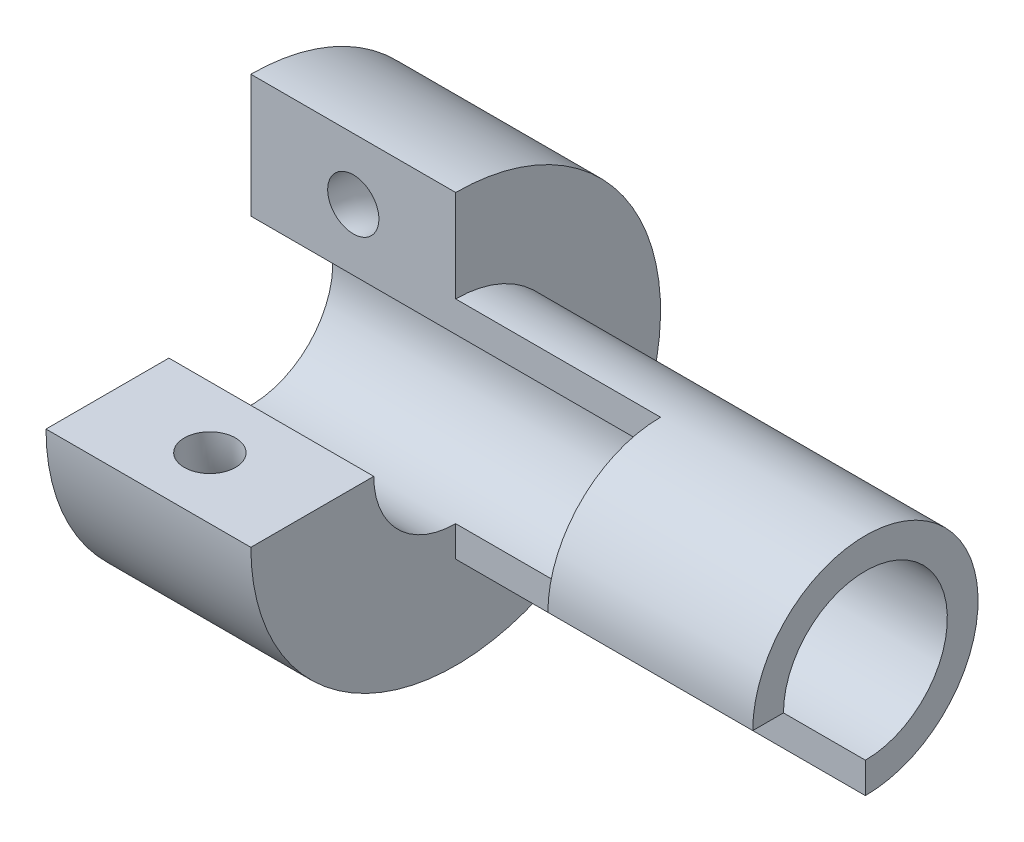
ISO-10303-21;
HEADER;
FILE_DESCRIPTION(('STEP AP214'),'2;1');
FILE_NAME('part.step','',(''),(''),'','','');
FILE_SCHEMA(('AUTOMOTIVE_DESIGN { 1 0 10303 214 1 1 1 1 }'));
ENDSEC;
DATA;
#1=APPLICATION_CONTEXT('core data for automotive mechanical design processes');
#2=APPLICATION_PROTOCOL_DEFINITION('international standard','automotive_design',2000,#1);
#3=PRODUCT_CONTEXT('',#1,'mechanical');
#4=PRODUCT('Part','Part','',(#3));
#5=PRODUCT_RELATED_PRODUCT_CATEGORY('part','',(#4));
#6=PRODUCT_DEFINITION_FORMATION('','',#4);
#7=PRODUCT_DEFINITION_CONTEXT('part definition',#1,'design');
#8=PRODUCT_DEFINITION('design','',#6,#7);
#9=PRODUCT_DEFINITION_SHAPE('','',#8);
#10=(LENGTH_UNIT() NAMED_UNIT(*) SI_UNIT(.MILLI.,.METRE.));
#11=(NAMED_UNIT(*) PLANE_ANGLE_UNIT() SI_UNIT($,.RADIAN.));
#12=(NAMED_UNIT(*) SI_UNIT($,.STERADIAN.) SOLID_ANGLE_UNIT());
#13=UNCERTAINTY_MEASURE_WITH_UNIT(LENGTH_MEASURE(1.E-05),#10,'distance_accuracy_value','');
#14=(GEOMETRIC_REPRESENTATION_CONTEXT(3) GLOBAL_UNCERTAINTY_ASSIGNED_CONTEXT((#13)) GLOBAL_UNIT_ASSIGNED_CONTEXT((#10,
#11,#12)) REPRESENTATION_CONTEXT('',''));
#15=CARTESIAN_POINT('',(0.,0.,0.));
#16=DIRECTION('',(0.,0.,1.));
#17=DIRECTION('',(1.,0.,0.));
#18=AXIS2_PLACEMENT_3D('',#15,#16,#17);
#19=CARTESIAN_POINT('',(-20.,0.,0.));
#20=DIRECTION('',(1.,0.,0.));
#21=DIRECTION('',(0.,0.,-1.));
#22=AXIS2_PLACEMENT_3D('',#19,#20,#21);
#23=PLANE('',#22);
#24=CARTESIAN_POINT('',(-20.,0.,0.));
#25=DIRECTION('',(1.,0.,0.));
#26=DIRECTION('',(0.,0.,-1.));
#27=AXIS2_PLACEMENT_3D('',#24,#25,#26);
#28=CIRCLE('',#27,8.);
#29=CARTESIAN_POINT('',(-20.,0.,8.));
#30=VERTEX_POINT('',#29);
#31=CARTESIAN_POINT('',(-20.,8.,0.));
#32=VERTEX_POINT('',#31);
#33=EDGE_CURVE('E131',#30,#32,#28,.T.);
#34=ORIENTED_EDGE('',*,*,#33,.T.);
#35=DIRECTION('',(0.,-1.,0.));
#36=VECTOR('',#35,1.);
#37=CARTESIAN_POINT('',(-20.,0.,0.));
#38=LINE('',#37,#36);
#39=CARTESIAN_POINT('',(-20.,20.,0.));
#40=VERTEX_POINT('',#39);
#41=EDGE_CURVE('E114',#40,#32,#38,.T.);
#42=ORIENTED_EDGE('',*,*,#41,.F.);
#43=CARTESIAN_POINT('',(-20.,0.,0.));
#44=DIRECTION('',(1.,0.,0.));
#45=DIRECTION('',(0.,0.,-1.));
#46=AXIS2_PLACEMENT_3D('',#43,#44,#45);
#47=CIRCLE('',#46,20.);
#48=CARTESIAN_POINT('',(-20.,0.,20.));
#49=VERTEX_POINT('',#48);
#50=EDGE_CURVE('E12',#49,#40,#47,.T.);
#51=ORIENTED_EDGE('',*,*,#50,.F.);
#52=DIRECTION('',(0.,0.,-1.));
#53=VECTOR('',#52,1.);
#54=CARTESIAN_POINT('',(-20.,0.,0.));
#55=LINE('',#54,#53);
#56=EDGE_CURVE('E125',#49,#30,#55,.T.);
#57=ORIENTED_EDGE('',*,*,#56,.T.);
#58=EDGE_LOOP('',(#34,#42,#51,#57));
#59=FACE_BOUND('',#58,.T.);
#60=ADVANCED_FACE('F41',(#59),#23,.F.);
#61=CARTESIAN_POINT('',(-20.,0.,0.));
#62=DIRECTION('',(1.,0.,0.));
#63=DIRECTION('',(0.,0.,-1.));
#64=AXIS2_PLACEMENT_3D('',#61,#62,#63);
#65=CYLINDRICAL_SURFACE('',#64,8.);
#66=DIRECTION('',(-1.,0.,0.));
#67=VECTOR('',#66,1.);
#68=CARTESIAN_POINT('',(20.,0.,8.));
#69=LINE('',#68,#67);
#70=CARTESIAN_POINT('',(0.,0.,8.));
#71=VERTEX_POINT('',#70);
#72=EDGE_CURVE('E174',#71,#30,#69,.T.);
#73=ORIENTED_EDGE('',*,*,#72,.F.);
#74=CARTESIAN_POINT('',(0.,0.,0.));
#75=DIRECTION('',(1.,0.,0.));
#76=DIRECTION('',(0.,0.,-1.));
#77=AXIS2_PLACEMENT_3D('',#74,#75,#76);
#78=CIRCLE('',#77,8.);
#79=CARTESIAN_POINT('',(0.,-8.,0.));
#80=VERTEX_POINT('',#79);
#81=EDGE_CURVE('E138',#71,#80,#78,.T.);
#82=ORIENTED_EDGE('',*,*,#81,.T.);
#83=DIRECTION('',(-1.,0.,0.));
#84=VECTOR('',#83,1.);
#85=CARTESIAN_POINT('',(40.,-8.,0.));
#86=LINE('',#85,#84);
#87=CARTESIAN_POINT('',(40.,-8.,0.));
#88=VERTEX_POINT('',#87);
#89=EDGE_CURVE('E153',#88,#80,#86,.T.);
#90=ORIENTED_EDGE('',*,*,#89,.F.);
#91=CARTESIAN_POINT('',(40.,0.,0.));
#92=DIRECTION('',(1.,0.,0.));
#93=DIRECTION('',(0.,0.,-1.));
#94=AXIS2_PLACEMENT_3D('',#91,#92,#93);
#95=CIRCLE('',#94,8.);
#96=CARTESIAN_POINT('',(40.,0.,8.));
#97=VERTEX_POINT('',#96);
#98=EDGE_CURVE('E145',#88,#97,#95,.T.);
#99=ORIENTED_EDGE('',*,*,#98,.T.);
#100=DIRECTION('',(-1.,0.,0.));
#101=VECTOR('',#100,1.);
#102=CARTESIAN_POINT('',(40.,0.,8.));
#103=LINE('',#102,#101);
#104=CARTESIAN_POINT('',(20.,0.,8.));
#105=VERTEX_POINT('',#104);
#106=EDGE_CURVE('E156',#97,#105,#103,.T.);
#107=ORIENTED_EDGE('',*,*,#106,.T.);
#108=CARTESIAN_POINT('',(20.,0.,0.));
#109=DIRECTION('',(-1.,0.,0.));
#110=DIRECTION('',(0.,0.,-1.));
#111=AXIS2_PLACEMENT_3D('',#108,#109,#110);
#112=CIRCLE('',#111,8.);
#113=CARTESIAN_POINT('',(20.,8.,0.));
#114=VERTEX_POINT('',#113);
#115=EDGE_CURVE('E133',#105,#114,#112,.T.);
#116=ORIENTED_EDGE('',*,*,#115,.T.);
#117=DIRECTION('',(-1.,0.,0.));
#118=VECTOR('',#117,1.);
#119=CARTESIAN_POINT('',(20.,8.,0.));
#120=LINE('',#119,#118);
#121=EDGE_CURVE('E117',#114,#32,#120,.T.);
#122=ORIENTED_EDGE('',*,*,#121,.T.);
#123=ORIENTED_EDGE('',*,*,#33,.F.);
#124=EDGE_LOOP('',(#73,#82,#90,#99,#107,#116,#122,#123));
#125=FACE_BOUND('',#124,.T.);
#126=ADVANCED_FACE('F130',(#125),#65,.F.);
#127=CARTESIAN_POINT('',(40.,0.,0.));
#128=DIRECTION('',(-1.,0.,0.));
#129=DIRECTION('',(0.,0.,1.));
#130=AXIS2_PLACEMENT_3D('',#127,#128,#129);
#131=CYLINDRICAL_SURFACE('',#130,11.);
#132=DIRECTION('',(-1.,0.,0.));
#133=VECTOR('',#132,1.);
#134=CARTESIAN_POINT('',(20.,11.,0.));
#135=LINE('',#134,#133);
#136=CARTESIAN_POINT('',(20.,11.,0.));
#137=VERTEX_POINT('',#136);
#138=CARTESIAN_POINT('',(0.,11.,0.));
#139=VERTEX_POINT('',#138);
#140=EDGE_CURVE('E135',#137,#139,#135,.T.);
#141=ORIENTED_EDGE('',*,*,#140,.F.);
#142=CARTESIAN_POINT('',(20.,0.,0.));
#143=DIRECTION('',(1.,0.,0.));
#144=DIRECTION('',(0.,0.,-1.));
#145=AXIS2_PLACEMENT_3D('',#142,#143,#144);
#146=CIRCLE('',#145,11.);
#147=CARTESIAN_POINT('',(20.,0.,11.));
#148=VERTEX_POINT('',#147);
#149=EDGE_CURVE('E179',#137,#148,#146,.T.);
#150=ORIENTED_EDGE('',*,*,#149,.T.);
#151=DIRECTION('',(-1.,0.,0.));
#152=VECTOR('',#151,1.);
#153=CARTESIAN_POINT('',(40.,0.,11.));
#154=LINE('',#153,#152);
#155=CARTESIAN_POINT('',(40.,0.,11.));
#156=VERTEX_POINT('',#155);
#157=EDGE_CURVE('E158',#156,#148,#154,.T.);
#158=ORIENTED_EDGE('',*,*,#157,.F.);
#159=CARTESIAN_POINT('',(40.,0.,0.));
#160=DIRECTION('',(1.,0.,0.));
#161=DIRECTION('',(0.,0.,-1.));
#162=AXIS2_PLACEMENT_3D('',#159,#160,#161);
#163=CIRCLE('',#162,11.);
#164=CARTESIAN_POINT('',(40.,-11.,0.));
#165=VERTEX_POINT('',#164);
#166=EDGE_CURVE('E141',#165,#156,#163,.T.);
#167=ORIENTED_EDGE('',*,*,#166,.F.);
#168=DIRECTION('',(-1.,0.,0.));
#169=VECTOR('',#168,1.);
#170=CARTESIAN_POINT('',(40.,-11.,0.));
#171=LINE('',#170,#169);
#172=CARTESIAN_POINT('',(0.,-11.,0.));
#173=VERTEX_POINT('',#172);
#174=EDGE_CURVE('E146',#165,#173,#171,.T.);
#175=ORIENTED_EDGE('',*,*,#174,.T.);
#176=CARTESIAN_POINT('',(0.,0.,0.));
#177=DIRECTION('',(1.,0.,0.));
#178=DIRECTION('',(0.,0.,-1.));
#179=AXIS2_PLACEMENT_3D('',#176,#177,#178);
#180=CIRCLE('',#179,11.);
#181=EDGE_CURVE('E58',#173,#139,#180,.T.);
#182=ORIENTED_EDGE('',*,*,#181,.T.);
#183=EDGE_LOOP('',(#141,#150,#158,#167,#175,#182));
#184=FACE_BOUND('',#183,.T.);
#185=ADVANCED_FACE('F215',(#184),#131,.T.);
#186=CARTESIAN_POINT('',(0.,0.,0.));
#187=DIRECTION('',(1.,0.,0.));
#188=DIRECTION('',(0.,0.,-1.));
#189=AXIS2_PLACEMENT_3D('',#186,#187,#188);
#190=PLANE('',#189);
#191=CARTESIAN_POINT('',(0.,0.,0.));
#192=DIRECTION('',(1.,0.,0.));
#193=DIRECTION('',(0.,0.,-1.));
#194=AXIS2_PLACEMENT_3D('',#191,#192,#193);
#195=CIRCLE('',#194,20.);
#196=CARTESIAN_POINT('',(0.,0.,20.));
#197=VERTEX_POINT('',#196);
#198=CARTESIAN_POINT('',(0.,20.,0.));
#199=VERTEX_POINT('',#198);
#200=EDGE_CURVE('E50',#197,#199,#195,.T.);
#201=ORIENTED_EDGE('',*,*,#200,.T.);
#202=DIRECTION('',(0.,-1.,0.));
#203=VECTOR('',#202,1.);
#204=CARTESIAN_POINT('',(0.,0.,0.));
#205=LINE('',#204,#203);
#206=EDGE_CURVE('E134',#199,#139,#205,.T.);
#207=ORIENTED_EDGE('',*,*,#206,.T.);
#208=ORIENTED_EDGE('',*,*,#181,.F.);
#209=DIRECTION('',(0.,1.,0.));
#210=VECTOR('',#209,1.);
#211=CARTESIAN_POINT('',(0.,-8.,0.));
#212=LINE('',#211,#210);
#213=EDGE_CURVE('E62',#173,#80,#212,.T.);
#214=ORIENTED_EDGE('',*,*,#213,.T.);
#215=ORIENTED_EDGE('',*,*,#81,.F.);
#216=DIRECTION('',(0.,0.,1.));
#217=VECTOR('',#216,1.);
#218=CARTESIAN_POINT('',(0.,0.,11.));
#219=LINE('',#218,#217);
#220=EDGE_CURVE('E162',#71,#197,#219,.T.);
#221=ORIENTED_EDGE('',*,*,#220,.T.);
#222=EDGE_LOOP('',(#201,#207,#208,#214,#215,#221));
#223=FACE_BOUND('',#222,.T.);
#224=ADVANCED_FACE('F202',(#223),#190,.T.);
#225=CARTESIAN_POINT('',(-20.,0.,0.));
#226=DIRECTION('',(1.,0.,0.));
#227=DIRECTION('',(0.,0.,-1.));
#228=AXIS2_PLACEMENT_3D('',#225,#226,#227);
#229=CYLINDRICAL_SURFACE('',#228,20.);
#230=ORIENTED_EDGE('',*,*,#50,.T.);
#231=DIRECTION('',(1.,0.,0.));
#232=VECTOR('',#231,1.);
#233=CARTESIAN_POINT('',(-20.,20.,0.));
#234=LINE('',#233,#232);
#235=EDGE_CURVE('E120',#40,#199,#234,.T.);
#236=ORIENTED_EDGE('',*,*,#235,.T.);
#237=ORIENTED_EDGE('',*,*,#200,.F.);
#238=DIRECTION('',(1.,0.,0.));
#239=VECTOR('',#238,1.);
#240=CARTESIAN_POINT('',(-20.,0.,20.));
#241=LINE('',#240,#239);
#242=EDGE_CURVE('E124',#49,#197,#241,.T.);
#243=ORIENTED_EDGE('',*,*,#242,.F.);
#244=EDGE_LOOP('',(#230,#236,#237,#243));
#245=FACE_BOUND('',#244,.T.);
#246=ADVANCED_FACE('F43',(#245),#229,.T.);
#247=CARTESIAN_POINT('',(40.,0.,0.));
#248=DIRECTION('',(1.,0.,0.));
#249=DIRECTION('',(0.,0.,-1.));
#250=AXIS2_PLACEMENT_3D('',#247,#248,#249);
#251=PLANE('',#250);
#252=ORIENTED_EDGE('',*,*,#98,.F.);
#253=DIRECTION('',(0.,1.,0.));
#254=VECTOR('',#253,1.);
#255=CARTESIAN_POINT('',(40.,-8.,0.));
#256=LINE('',#255,#254);
#257=EDGE_CURVE('E164',#165,#88,#256,.T.);
#258=ORIENTED_EDGE('',*,*,#257,.F.);
#259=ORIENTED_EDGE('',*,*,#166,.T.);
#260=DIRECTION('',(0.,0.,1.));
#261=VECTOR('',#260,1.);
#262=CARTESIAN_POINT('',(40.,0.,11.));
#263=LINE('',#262,#261);
#264=EDGE_CURVE('E161',#97,#156,#263,.T.);
#265=ORIENTED_EDGE('',*,*,#264,.F.);
#266=EDGE_LOOP('',(#252,#258,#259,#265));
#267=FACE_BOUND('',#266,.T.);
#268=ADVANCED_FACE('F210',(#267),#251,.T.);
#269=CARTESIAN_POINT('',(40.,0.,11.));
#270=DIRECTION('',(0.,-1.,0.));
#271=DIRECTION('',(0.,0.,-1.));
#272=AXIS2_PLACEMENT_3D('',#269,#270,#271);
#273=PLANE('',#272);
#274=DIRECTION('',(0.,0.,-1.));
#275=VECTOR('',#274,1.);
#276=CARTESIAN_POINT('',(20.,0.,11.));
#277=LINE('',#276,#275);
#278=EDGE_CURVE('E176',#148,#105,#277,.T.);
#279=ORIENTED_EDGE('',*,*,#278,.T.);
#280=ORIENTED_EDGE('',*,*,#106,.F.);
#281=ORIENTED_EDGE('',*,*,#264,.T.);
#282=ORIENTED_EDGE('',*,*,#157,.T.);
#283=EDGE_LOOP('',(#279,#280,#281,#282));
#284=FACE_BOUND('',#283,.T.);
#285=ADVANCED_FACE('F218',(#284),#273,.T.);
#286=CARTESIAN_POINT('',(40.,-8.,0.));
#287=DIRECTION('',(0.,0.,1.));
#288=DIRECTION('',(1.,0.,0.));
#289=AXIS2_PLACEMENT_3D('',#286,#287,#288);
#290=PLANE('',#289);
#291=ORIENTED_EDGE('',*,*,#213,.F.);
#292=ORIENTED_EDGE('',*,*,#174,.F.);
#293=ORIENTED_EDGE('',*,*,#257,.T.);
#294=ORIENTED_EDGE('',*,*,#89,.T.);
#295=EDGE_LOOP('',(#291,#292,#293,#294));
#296=FACE_BOUND('',#295,.T.);
#297=ADVANCED_FACE('F206',(#296),#290,.T.);
#298=CARTESIAN_POINT('',(-20.,0.,0.));
#299=DIRECTION('',(0.,0.,1.));
#300=DIRECTION('',(1.,0.,0.));
#301=AXIS2_PLACEMENT_3D('',#298,#299,#300);
#302=PLANE('',#301);
#303=CARTESIAN_POINT('',(-10.,14.,0.));
#304=DIRECTION('',(0.,0.,1.));
#305=DIRECTION('',(1.,0.,0.));
#306=AXIS2_PLACEMENT_3D('',#303,#304,#305);
#307=CIRCLE('',#306,2.5);
#308=CARTESIAN_POINT('',(-10.,16.5,0.));
#309=VERTEX_POINT('',#308);
#310=EDGE_CURVE('E185',#309,#309,#307,.T.);
#311=ORIENTED_EDGE('',*,*,#310,.F.);
#312=EDGE_LOOP('',(#311));
#313=FACE_BOUND('',#312,.T.);
#314=ORIENTED_EDGE('',*,*,#206,.F.);
#315=ORIENTED_EDGE('',*,*,#235,.F.);
#316=ORIENTED_EDGE('',*,*,#41,.T.);
#317=ORIENTED_EDGE('',*,*,#121,.F.);
#318=DIRECTION('',(0.,1.,0.));
#319=VECTOR('',#318,1.);
#320=CARTESIAN_POINT('',(20.,8.,0.));
#321=LINE('',#320,#319);
#322=EDGE_CURVE('E182',#114,#137,#321,.T.);
#323=ORIENTED_EDGE('',*,*,#322,.T.);
#324=ORIENTED_EDGE('',*,*,#140,.T.);
#325=EDGE_LOOP('',(#314,#315,#316,#317,#323,#324));
#326=FACE_BOUND('',#325,.T.);
#327=ADVANCED_FACE('F116',(#313,#326),#302,.T.);
#328=CARTESIAN_POINT('',(-20.,0.,0.));
#329=DIRECTION('',(0.,-1.,0.));
#330=DIRECTION('',(0.,0.,-1.));
#331=AXIS2_PLACEMENT_3D('',#328,#329,#330);
#332=PLANE('',#331);
#333=CARTESIAN_POINT('',(-10.,0.,14.));
#334=DIRECTION('',(0.,-1.,0.));
#335=DIRECTION('',(0.,0.,-1.));
#336=AXIS2_PLACEMENT_3D('',#333,#334,#335);
#337=CIRCLE('',#336,2.5);
#338=CARTESIAN_POINT('',(-10.,0.,16.5));
#339=VERTEX_POINT('',#338);
#340=EDGE_CURVE('E45',#339,#339,#337,.F.);
#341=ORIENTED_EDGE('',*,*,#340,.F.);
#342=EDGE_LOOP('',(#341));
#343=FACE_BOUND('',#342,.T.);
#344=ORIENTED_EDGE('',*,*,#242,.T.);
#345=ORIENTED_EDGE('',*,*,#220,.F.);
#346=ORIENTED_EDGE('',*,*,#72,.T.);
#347=ORIENTED_EDGE('',*,*,#56,.F.);
#348=EDGE_LOOP('',(#344,#345,#346,#347));
#349=FACE_BOUND('',#348,.T.);
#350=ADVANCED_FACE('F194',(#343,#349),#332,.F.);
#351=CARTESIAN_POINT('',(20.,0.,0.));
#352=DIRECTION('',(1.,0.,0.));
#353=DIRECTION('',(0.,0.,-1.));
#354=AXIS2_PLACEMENT_3D('',#351,#352,#353);
#355=PLANE('',#354);
#356=ORIENTED_EDGE('',*,*,#115,.F.);
#357=ORIENTED_EDGE('',*,*,#278,.F.);
#358=ORIENTED_EDGE('',*,*,#149,.F.);
#359=ORIENTED_EDGE('',*,*,#322,.F.);
#360=EDGE_LOOP('',(#356,#357,#358,#359));
#361=FACE_BOUND('',#360,.T.);
#362=ADVANCED_FACE('F197',(#361),#355,.F.);
#363=CARTESIAN_POINT('',(-10.,0.,0.));
#364=DIRECTION('',(-1.,0.,0.));
#365=DIRECTION('',(0.,0.,1.));
#366=AXIS2_PLACEMENT_3D('',#363,#364,#365);
#367=TOROIDAL_SURFACE('',#366,14.,2.5);
#368=CARTESIAN_POINT('',(-10.,0.,0.));
#369=DIRECTION('',(-1.,0.,0.));
#370=DIRECTION('',(0.,0.,1.));
#371=AXIS2_PLACEMENT_3D('',#368,#369,#370);
#372=CIRCLE('',#371,16.5);
#373=EDGE_CURVE('',#309,#339,#372,.T.);
#374=ORIENTED_EDGE('',*,*,#310,.T.);
#375=ORIENTED_EDGE('',*,*,#340,.T.);
#376=ORIENTED_EDGE('',*,*,#373,.T.);
#377=ORIENTED_EDGE('',*,*,#373,.F.);
#378=EDGE_LOOP('',(#374,#376,#375,#377));
#379=FACE_BOUND('',#378,.T.);
#380=ADVANCED_FACE('F192',(#379),#367,.F.);
#381=CLOSED_SHELL('',(#60,#126,#185,#224,#246,#268,#285,#297,#327,#350,#362,#380));
#382=MANIFOLD_SOLID_BREP('B2',#381);
#383=ADVANCED_BREP_SHAPE_REPRESENTATION('',(#18,#382),#14);
#384=SHAPE_DEFINITION_REPRESENTATION(#9,#383);
ENDSEC;
END-ISO-10303-21;
